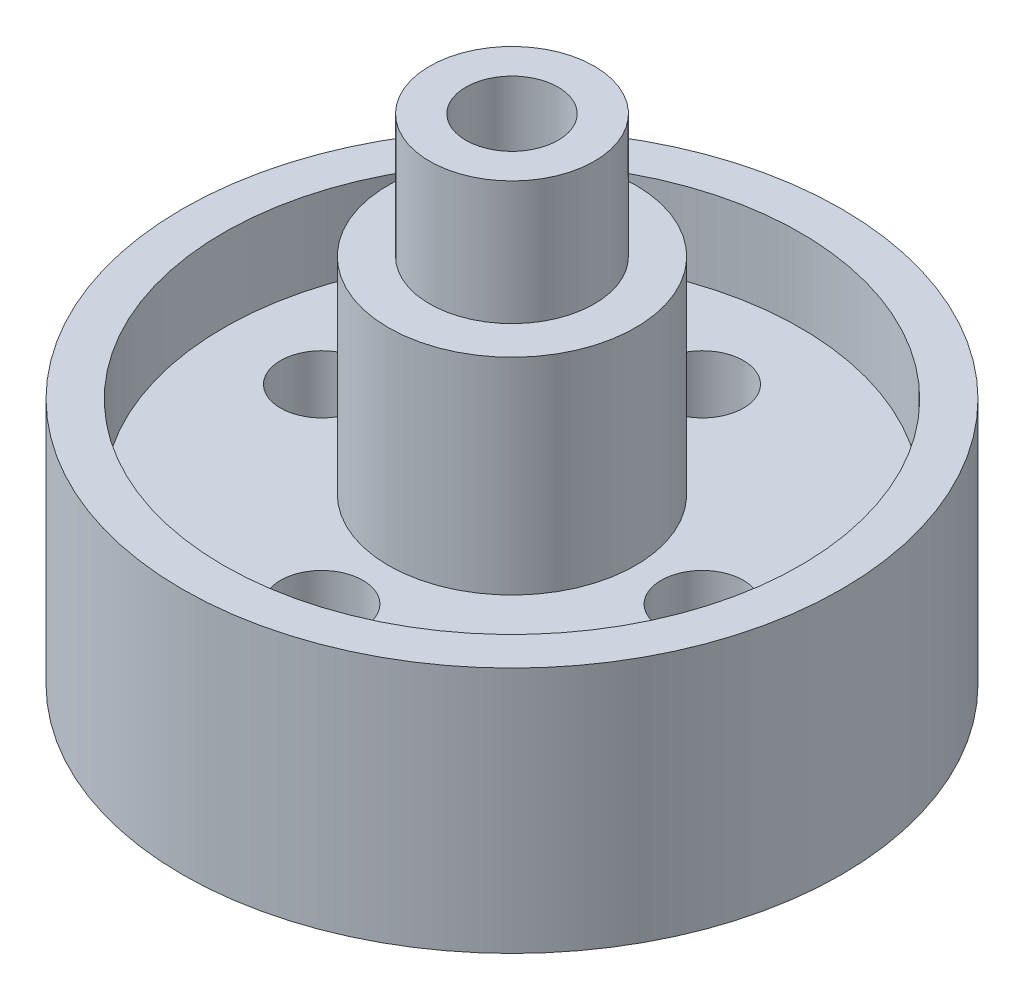
ISO-10303-21;
HEADER;
FILE_DESCRIPTION(('STEP AP214'),'2;1');
FILE_NAME('part.step','',(''),(''),'','','');
FILE_SCHEMA(('AUTOMOTIVE_DESIGN { 1 0 10303 214 1 1 1 1 }'));
ENDSEC;
DATA;
#1=APPLICATION_CONTEXT('core data for automotive mechanical design processes');
#2=APPLICATION_PROTOCOL_DEFINITION('international standard','automotive_design',2000,#1);
#3=PRODUCT_CONTEXT('',#1,'mechanical');
#4=PRODUCT('Part','Part','',(#3));
#5=PRODUCT_RELATED_PRODUCT_CATEGORY('part','',(#4));
#6=PRODUCT_DEFINITION_FORMATION('','',#4);
#7=PRODUCT_DEFINITION_CONTEXT('part definition',#1,'design');
#8=PRODUCT_DEFINITION('design','',#6,#7);
#9=PRODUCT_DEFINITION_SHAPE('','',#8);
#10=(LENGTH_UNIT() NAMED_UNIT(*) SI_UNIT(.MILLI.,.METRE.));
#11=(NAMED_UNIT(*) PLANE_ANGLE_UNIT() SI_UNIT($,.RADIAN.));
#12=(NAMED_UNIT(*) SI_UNIT($,.STERADIAN.) SOLID_ANGLE_UNIT());
#13=UNCERTAINTY_MEASURE_WITH_UNIT(LENGTH_MEASURE(1.E-05),#10,'distance_accuracy_value','');
#14=(GEOMETRIC_REPRESENTATION_CONTEXT(3) GLOBAL_UNCERTAINTY_ASSIGNED_CONTEXT((#13)) GLOBAL_UNIT_ASSIGNED_CONTEXT((#10,
#11,#12)) REPRESENTATION_CONTEXT('',''));
#15=CARTESIAN_POINT('',(0.,0.,0.));
#16=DIRECTION('',(0.,0.,1.));
#17=DIRECTION('',(1.,0.,0.));
#18=AXIS2_PLACEMENT_3D('',#15,#16,#17);
#19=CARTESIAN_POINT('',(0.,25.4,0.));
#20=DIRECTION('',(0.,-1.,0.));
#21=DIRECTION('',(0.,0.,-1.));
#22=AXIS2_PLACEMENT_3D('',#19,#20,#21);
#23=CYLINDRICAL_SURFACE('',#22,50.8);
#24=CARTESIAN_POINT('',(0.,0.,0.));
#25=DIRECTION('',(0.,1.,0.));
#26=DIRECTION('',(0.,0.,1.));
#27=AXIS2_PLACEMENT_3D('',#24,#25,#26);
#28=CIRCLE('',#27,50.8);
#29=CARTESIAN_POINT('',(0.,0.,50.8));
#30=VERTEX_POINT('',#29);
#31=EDGE_CURVE('E58',#30,#30,#28,.T.);
#32=ORIENTED_EDGE('',*,*,#31,.T.);
#33=EDGE_LOOP('',(#32));
#34=FACE_BOUND('',#33,.T.);
#35=CARTESIAN_POINT('',(0.,38.1,0.));
#36=DIRECTION('',(0.,1.,0.));
#37=DIRECTION('',(0.,0.,1.));
#38=AXIS2_PLACEMENT_3D('',#35,#36,#37);
#39=CIRCLE('',#38,50.8);
#40=CARTESIAN_POINT('',(0.,38.1,50.8));
#41=VERTEX_POINT('',#40);
#42=EDGE_CURVE('E75',#41,#41,#39,.T.);
#43=ORIENTED_EDGE('',*,*,#42,.F.);
#44=EDGE_LOOP('',(#43));
#45=FACE_BOUND('',#44,.T.);
#46=ADVANCED_FACE('F45',(#34,#45),#23,.T.);
#47=CARTESIAN_POINT('',(0.,25.4,0.));
#48=DIRECTION('',(0.,1.,0.));
#49=DIRECTION('',(0.,0.,1.));
#50=AXIS2_PLACEMENT_3D('',#47,#48,#49);
#51=PLANE('',#50);
#52=CARTESIAN_POINT('',(0.,25.4,0.));
#53=DIRECTION('',(0.,1.,0.));
#54=DIRECTION('',(0.,0.,1.));
#55=AXIS2_PLACEMENT_3D('',#52,#53,#54);
#56=CIRCLE('',#55,19.05);
#57=CARTESIAN_POINT('',(0.,25.4,19.05));
#58=VERTEX_POINT('',#57);
#59=EDGE_CURVE('E68',#58,#58,#56,.T.);
#60=ORIENTED_EDGE('',*,*,#59,.F.);
#61=EDGE_LOOP('',(#60));
#62=FACE_BOUND('',#61,.T.);
#63=CARTESIAN_POINT('',(0.,25.4,0.));
#64=DIRECTION('',(0.,1.,0.));
#65=DIRECTION('',(0.,0.,1.));
#66=AXIS2_PLACEMENT_3D('',#63,#64,#65);
#67=CIRCLE('',#66,44.45);
#68=CARTESIAN_POINT('',(0.,25.4,44.45));
#69=VERTEX_POINT('',#68);
#70=EDGE_CURVE('E48',#69,#69,#67,.F.);
#71=ORIENTED_EDGE('',*,*,#70,.F.);
#72=EDGE_LOOP('',(#71));
#73=FACE_BOUND('',#72,.T.);
#74=CARTESIAN_POINT('',(-29.337,25.4,0.));
#75=DIRECTION('',(0.,1.,0.));
#76=DIRECTION('',(0.,0.,1.));
#77=AXIS2_PLACEMENT_3D('',#74,#75,#76);
#78=CIRCLE('',#77,6.35);
#79=CARTESIAN_POINT('',(-29.337,25.4,6.35));
#80=VERTEX_POINT('',#79);
#81=EDGE_CURVE('E84',#80,#80,#78,.T.);
#82=ORIENTED_EDGE('',*,*,#81,.F.);
#83=EDGE_LOOP('',(#82));
#84=FACE_BOUND('',#83,.T.);
#85=CARTESIAN_POINT('',(1.02429588037641E-13,25.4,-29.337));
#86=DIRECTION('',(0.,1.,0.));
#87=DIRECTION('',(0.,0.,1.));
#88=AXIS2_PLACEMENT_3D('',#85,#86,#87);
#89=CIRCLE('',#88,6.35);
#90=CARTESIAN_POINT('',(1.02429588037641E-13,25.4,-22.987));
#91=VERTEX_POINT('',#90);
#92=EDGE_CURVE('E88',#91,#91,#89,.T.);
#93=ORIENTED_EDGE('',*,*,#92,.F.);
#94=EDGE_LOOP('',(#93));
#95=FACE_BOUND('',#94,.T.);
#96=CARTESIAN_POINT('',(29.337,25.4,2.04859176075282E-13));
#97=DIRECTION('',(0.,1.,0.));
#98=DIRECTION('',(0.,0.,1.));
#99=AXIS2_PLACEMENT_3D('',#96,#97,#98);
#100=CIRCLE('',#99,6.35);
#101=CARTESIAN_POINT('',(29.337,25.4,6.35000000000021));
#102=VERTEX_POINT('',#101);
#103=EDGE_CURVE('E96',#102,#102,#100,.T.);
#104=ORIENTED_EDGE('',*,*,#103,.F.);
#105=EDGE_LOOP('',(#104));
#106=FACE_BOUND('',#105,.T.);
#107=CARTESIAN_POINT('',(-3.07288764112923E-13,25.4,29.337));
#108=DIRECTION('',(0.,1.,0.));
#109=DIRECTION('',(0.,0.,1.));
#110=AXIS2_PLACEMENT_3D('',#107,#108,#109);
#111=CIRCLE('',#110,6.35);
#112=CARTESIAN_POINT('',(-3.07288764112923E-13,25.4,35.687));
#113=VERTEX_POINT('',#112);
#114=EDGE_CURVE('E104',#113,#113,#111,.T.);
#115=ORIENTED_EDGE('',*,*,#114,.F.);
#116=EDGE_LOOP('',(#115));
#117=FACE_BOUND('',#116,.T.);
#118=ADVANCED_FACE('F119',(#62,#73,#84,#95,#106,#117),#51,.T.);
#119=CARTESIAN_POINT('',(0.,0.,0.));
#120=DIRECTION('',(0.,1.,0.));
#121=DIRECTION('',(0.,0.,1.));
#122=AXIS2_PLACEMENT_3D('',#119,#120,#121);
#123=PLANE('',#122);
#124=CARTESIAN_POINT('',(0.,0.,0.));
#125=DIRECTION('',(0.,1.,0.));
#126=DIRECTION('',(0.,0.,1.));
#127=AXIS2_PLACEMENT_3D('',#124,#125,#126);
#128=CIRCLE('',#127,7.112);
#129=CARTESIAN_POINT('',(0.,0.,7.112));
#130=VERTEX_POINT('',#129);
#131=EDGE_CURVE('E281',#130,#130,#128,.T.);
#132=ORIENTED_EDGE('',*,*,#131,.T.);
#133=EDGE_LOOP('',(#132));
#134=FACE_BOUND('',#133,.T.);
#135=CARTESIAN_POINT('',(-29.337,0.,0.));
#136=DIRECTION('',(0.,1.,0.));
#137=DIRECTION('',(0.,0.,1.));
#138=AXIS2_PLACEMENT_3D('',#135,#136,#137);
#139=CIRCLE('',#138,6.35);
#140=CARTESIAN_POINT('',(-29.337,0.,6.35));
#141=VERTEX_POINT('',#140);
#142=EDGE_CURVE('E80',#141,#141,#139,.T.);
#143=ORIENTED_EDGE('',*,*,#142,.T.);
#144=EDGE_LOOP('',(#143));
#145=FACE_BOUND('',#144,.T.);
#146=CARTESIAN_POINT('',(1.02429588037641E-13,0.,-29.337));
#147=DIRECTION('',(0.,1.,0.));
#148=DIRECTION('',(0.,0.,1.));
#149=AXIS2_PLACEMENT_3D('',#146,#147,#148);
#150=CIRCLE('',#149,6.35);
#151=CARTESIAN_POINT('',(1.02429588037641E-13,0.,-22.987));
#152=VERTEX_POINT('',#151);
#153=EDGE_CURVE('E92',#152,#152,#150,.T.);
#154=ORIENTED_EDGE('',*,*,#153,.T.);
#155=EDGE_LOOP('',(#154));
#156=FACE_BOUND('',#155,.T.);
#157=CARTESIAN_POINT('',(29.337,0.,2.04859176075282E-13));
#158=DIRECTION('',(0.,1.,0.));
#159=DIRECTION('',(0.,0.,1.));
#160=AXIS2_PLACEMENT_3D('',#157,#158,#159);
#161=CIRCLE('',#160,6.35);
#162=CARTESIAN_POINT('',(29.337,0.,6.35000000000021));
#163=VERTEX_POINT('',#162);
#164=EDGE_CURVE('E100',#163,#163,#161,.T.);
#165=ORIENTED_EDGE('',*,*,#164,.T.);
#166=EDGE_LOOP('',(#165));
#167=FACE_BOUND('',#166,.T.);
#168=CARTESIAN_POINT('',(-3.07288764112923E-13,0.,29.337));
#169=DIRECTION('',(0.,1.,0.));
#170=DIRECTION('',(0.,0.,1.));
#171=AXIS2_PLACEMENT_3D('',#168,#169,#170);
#172=CIRCLE('',#171,6.35);
#173=CARTESIAN_POINT('',(-3.07288764112923E-13,0.,35.687));
#174=VERTEX_POINT('',#173);
#175=EDGE_CURVE('E79',#174,#174,#172,.T.);
#176=ORIENTED_EDGE('',*,*,#175,.T.);
#177=EDGE_LOOP('',(#176));
#178=FACE_BOUND('',#177,.T.);
#179=ORIENTED_EDGE('',*,*,#31,.F.);
#180=EDGE_LOOP('',(#179));
#181=FACE_BOUND('',#180,.T.);
#182=ADVANCED_FACE('F116',(#134,#145,#156,#167,#178,#181),#123,.F.);
#183=CARTESIAN_POINT('',(-3.07288764112923E-13,0.,29.337));
#184=DIRECTION('',(0.,1.,0.));
#185=DIRECTION('',(0.,0.,1.));
#186=AXIS2_PLACEMENT_3D('',#183,#184,#185);
#187=CYLINDRICAL_SURFACE('',#186,6.35);
#188=ORIENTED_EDGE('',*,*,#175,.F.);
#189=EDGE_LOOP('',(#188));
#190=FACE_BOUND('',#189,.T.);
#191=ORIENTED_EDGE('',*,*,#114,.T.);
#192=EDGE_LOOP('',(#191));
#193=FACE_BOUND('',#192,.T.);
#194=ADVANCED_FACE('F118',(#190,#193),#187,.F.);
#195=CARTESIAN_POINT('',(29.337,0.,2.04859176075282E-13));
#196=DIRECTION('',(0.,1.,0.));
#197=DIRECTION('',(0.,0.,1.));
#198=AXIS2_PLACEMENT_3D('',#195,#196,#197);
#199=CYLINDRICAL_SURFACE('',#198,6.35);
#200=ORIENTED_EDGE('',*,*,#164,.F.);
#201=EDGE_LOOP('',(#200));
#202=FACE_BOUND('',#201,.T.);
#203=ORIENTED_EDGE('',*,*,#103,.T.);
#204=EDGE_LOOP('',(#203));
#205=FACE_BOUND('',#204,.T.);
#206=ADVANCED_FACE('F126',(#202,#205),#199,.F.);
#207=CARTESIAN_POINT('',(1.02429588037641E-13,0.,-29.337));
#208=DIRECTION('',(0.,1.,0.));
#209=DIRECTION('',(0.,0.,1.));
#210=AXIS2_PLACEMENT_3D('',#207,#208,#209);
#211=CYLINDRICAL_SURFACE('',#210,6.35);
#212=ORIENTED_EDGE('',*,*,#153,.F.);
#213=EDGE_LOOP('',(#212));
#214=FACE_BOUND('',#213,.T.);
#215=ORIENTED_EDGE('',*,*,#92,.T.);
#216=EDGE_LOOP('',(#215));
#217=FACE_BOUND('',#216,.T.);
#218=ADVANCED_FACE('F219',(#214,#217),#211,.F.);
#219=CARTESIAN_POINT('',(-29.337,0.,0.));
#220=DIRECTION('',(0.,1.,0.));
#221=DIRECTION('',(0.,0.,1.));
#222=AXIS2_PLACEMENT_3D('',#219,#220,#221);
#223=CYLINDRICAL_SURFACE('',#222,6.35);
#224=ORIENTED_EDGE('',*,*,#142,.F.);
#225=EDGE_LOOP('',(#224));
#226=FACE_BOUND('',#225,.T.);
#227=ORIENTED_EDGE('',*,*,#81,.T.);
#228=EDGE_LOOP('',(#227));
#229=FACE_BOUND('',#228,.T.);
#230=ADVANCED_FACE('F143',(#226,#229),#223,.F.);
#231=CARTESIAN_POINT('',(0.,38.1,0.));
#232=DIRECTION('',(0.,-1.,0.));
#233=DIRECTION('',(0.,0.,-1.));
#234=AXIS2_PLACEMENT_3D('',#231,#232,#233);
#235=CYLINDRICAL_SURFACE('',#234,44.45);
#236=CARTESIAN_POINT('',(0.,38.1,0.));
#237=DIRECTION('',(0.,1.,0.));
#238=DIRECTION('',(0.,0.,1.));
#239=AXIS2_PLACEMENT_3D('',#236,#237,#238);
#240=CIRCLE('',#239,44.45);
#241=CARTESIAN_POINT('',(0.,38.1,44.45));
#242=VERTEX_POINT('',#241);
#243=EDGE_CURVE('E67',#242,#242,#240,.T.);
#244=ORIENTED_EDGE('',*,*,#243,.T.);
#245=EDGE_LOOP('',(#244));
#246=FACE_BOUND('',#245,.T.);
#247=ORIENTED_EDGE('',*,*,#70,.T.);
#248=EDGE_LOOP('',(#247));
#249=FACE_BOUND('',#248,.T.);
#250=ADVANCED_FACE('F147',(#246,#249),#235,.F.);
#251=CARTESIAN_POINT('',(0.,38.1,0.));
#252=DIRECTION('',(0.,1.,0.));
#253=DIRECTION('',(0.,0.,1.));
#254=AXIS2_PLACEMENT_3D('',#251,#252,#253);
#255=PLANE('',#254);
#256=ORIENTED_EDGE('',*,*,#243,.F.);
#257=EDGE_LOOP('',(#256));
#258=FACE_BOUND('',#257,.T.);
#259=ORIENTED_EDGE('',*,*,#42,.T.);
#260=EDGE_LOOP('',(#259));
#261=FACE_BOUND('',#260,.T.);
#262=ADVANCED_FACE('F150',(#258,#261),#255,.T.);
#263=CARTESIAN_POINT('',(0.,57.15,0.));
#264=DIRECTION('',(0.,-1.,0.));
#265=DIRECTION('',(0.,0.,-1.));
#266=AXIS2_PLACEMENT_3D('',#263,#264,#265);
#267=CYLINDRICAL_SURFACE('',#266,19.05);
#268=CARTESIAN_POINT('',(0.,57.15,0.));
#269=DIRECTION('',(0.,1.,0.));
#270=DIRECTION('',(0.,0.,1.));
#271=AXIS2_PLACEMENT_3D('',#268,#269,#270);
#272=CIRCLE('',#271,19.05);
#273=CARTESIAN_POINT('',(0.,57.15,19.05));
#274=VERTEX_POINT('',#273);
#275=EDGE_CURVE('E63',#274,#274,#272,.T.);
#276=ORIENTED_EDGE('',*,*,#275,.F.);
#277=EDGE_LOOP('',(#276));
#278=FACE_BOUND('',#277,.T.);
#279=ORIENTED_EDGE('',*,*,#59,.T.);
#280=EDGE_LOOP('',(#279));
#281=FACE_BOUND('',#280,.T.);
#282=ADVANCED_FACE('F158',(#278,#281),#267,.T.);
#283=CARTESIAN_POINT('',(0.,57.15,0.));
#284=DIRECTION('',(0.,1.,0.));
#285=DIRECTION('',(0.,0.,1.));
#286=AXIS2_PLACEMENT_3D('',#283,#284,#285);
#287=PLANE('',#286);
#288=CARTESIAN_POINT('',(0.,57.15,0.));
#289=DIRECTION('',(0.,1.,0.));
#290=DIRECTION('',(0.,0.,1.));
#291=AXIS2_PLACEMENT_3D('',#288,#289,#290);
#292=CIRCLE('',#291,12.7);
#293=CARTESIAN_POINT('',(0.,57.15,-12.7));
#294=VERTEX_POINT('',#293);
#295=EDGE_CURVE('E10',#294,#294,#292,.T.);
#296=ORIENTED_EDGE('',*,*,#295,.F.);
#297=EDGE_LOOP('',(#296));
#298=FACE_BOUND('',#297,.T.);
#299=ORIENTED_EDGE('',*,*,#275,.T.);
#300=EDGE_LOOP('',(#299));
#301=FACE_BOUND('',#300,.T.);
#302=ADVANCED_FACE('F174',(#298,#301),#287,.T.);
#303=CARTESIAN_POINT('',(0.,76.2,0.));
#304=DIRECTION('',(0.,-1.,0.));
#305=DIRECTION('',(0.,0.,-1.));
#306=AXIS2_PLACEMENT_3D('',#303,#304,#305);
#307=CYLINDRICAL_SURFACE('',#306,12.7);
#308=CARTESIAN_POINT('',(0.,76.2,0.));
#309=DIRECTION('',(0.,1.,0.));
#310=DIRECTION('',(0.,0.,1.));
#311=AXIS2_PLACEMENT_3D('',#308,#309,#310);
#312=CIRCLE('',#311,12.7);
#313=CARTESIAN_POINT('',(0.,76.2,-12.7));
#314=VERTEX_POINT('',#313);
#315=EDGE_CURVE('E61',#314,#314,#312,.T.);
#316=CARTESIAN_POINT('',(0.,76.2,-12.7));
#317=CARTESIAN_POINT('',(0.,76.0015625,-12.7));
#318=CARTESIAN_POINT('',(0.,75.803125,-12.7));
#319=CARTESIAN_POINT('',(0.,75.40625,-12.7));
#320=CARTESIAN_POINT('',(0.,75.2078125,-12.7));
#321=CARTESIAN_POINT('',(0.,74.8109375,-12.7));
#322=CARTESIAN_POINT('',(0.,74.6125,-12.7));
#323=CARTESIAN_POINT('',(0.,74.215625,-12.7));
#324=CARTESIAN_POINT('',(0.,74.0171875,-12.7));
#325=CARTESIAN_POINT('',(0.,73.6203125,-12.7));
#326=CARTESIAN_POINT('',(0.,73.421875,-12.7));
#327=CARTESIAN_POINT('',(0.,73.025,-12.7));
#328=CARTESIAN_POINT('',(0.,72.8265625,-12.7));
#329=CARTESIAN_POINT('',(0.,72.4296875,-12.7));
#330=CARTESIAN_POINT('',(0.,72.23125,-12.7));
#331=CARTESIAN_POINT('',(0.,71.834375,-12.7));
#332=CARTESIAN_POINT('',(0.,71.6359375,-12.7));
#333=CARTESIAN_POINT('',(0.,71.2390625,-12.7));
#334=CARTESIAN_POINT('',(0.,71.040625,-12.7));
#335=CARTESIAN_POINT('',(0.,70.64375,-12.7));
#336=CARTESIAN_POINT('',(0.,70.4453125,-12.7));
#337=CARTESIAN_POINT('',(0.,70.0484375,-12.7));
#338=CARTESIAN_POINT('',(0.,69.85,-12.7));
#339=CARTESIAN_POINT('',(0.,69.453125,-12.7));
#340=CARTESIAN_POINT('',(0.,69.2546875,-12.7));
#341=CARTESIAN_POINT('',(0.,68.8578125,-12.7));
#342=CARTESIAN_POINT('',(0.,68.659375,-12.7));
#343=CARTESIAN_POINT('',(0.,68.2625,-12.7));
#344=CARTESIAN_POINT('',(0.,68.0640625,-12.7));
#345=CARTESIAN_POINT('',(0.,67.6671875,-12.7));
#346=CARTESIAN_POINT('',(0.,67.46875,-12.7));
#347=CARTESIAN_POINT('',(0.,67.071875,-12.7));
#348=CARTESIAN_POINT('',(0.,66.8734375,-12.7));
#349=CARTESIAN_POINT('',(0.,66.4765625,-12.7));
#350=CARTESIAN_POINT('',(0.,66.278125,-12.7));
#351=CARTESIAN_POINT('',(0.,65.88125,-12.7));
#352=CARTESIAN_POINT('',(0.,65.6828125,-12.7));
#353=CARTESIAN_POINT('',(0.,65.2859375,-12.7));
#354=CARTESIAN_POINT('',(0.,65.0875,-12.7));
#355=CARTESIAN_POINT('',(0.,64.690625,-12.7));
#356=CARTESIAN_POINT('',(0.,64.4921875,-12.7));
#357=CARTESIAN_POINT('',(0.,64.0953125,-12.7));
#358=CARTESIAN_POINT('',(0.,63.896875,-12.7));
#359=CARTESIAN_POINT('',(0.,63.5,-12.7));
#360=CARTESIAN_POINT('',(0.,63.3015625,-12.7));
#361=CARTESIAN_POINT('',(0.,62.9046875,-12.7));
#362=CARTESIAN_POINT('',(0.,62.70625,-12.7));
#363=CARTESIAN_POINT('',(0.,62.309375,-12.7));
#364=CARTESIAN_POINT('',(0.,62.1109375,-12.7));
#365=CARTESIAN_POINT('',(0.,61.7140625,-12.7));
#366=CARTESIAN_POINT('',(0.,61.515625,-12.7));
#367=CARTESIAN_POINT('',(0.,61.11875,-12.7));
#368=CARTESIAN_POINT('',(0.,60.9203125,-12.7));
#369=CARTESIAN_POINT('',(0.,60.5234375,-12.7));
#370=CARTESIAN_POINT('',(0.,60.325,-12.7));
#371=CARTESIAN_POINT('',(0.,59.928125,-12.7));
#372=CARTESIAN_POINT('',(0.,59.7296875,-12.7));
#373=CARTESIAN_POINT('',(0.,59.3328125,-12.7));
#374=CARTESIAN_POINT('',(0.,59.134375,-12.7));
#375=CARTESIAN_POINT('',(0.,58.7375,-12.7));
#376=CARTESIAN_POINT('',(0.,58.5390625,-12.7));
#377=CARTESIAN_POINT('',(0.,58.1421875,-12.7));
#378=CARTESIAN_POINT('',(0.,57.94375,-12.7));
#379=CARTESIAN_POINT('',(0.,57.546875,-12.7));
#380=CARTESIAN_POINT('',(0.,57.3484375,-12.7));
#381=CARTESIAN_POINT('',(0.,57.15,-12.7));
#382=B_SPLINE_CURVE_WITH_KNOTS('',3,(#316,#317,#318,#319,#320,#321,#322,#323,#324,#325,#326,
#327,#328,#329,#330,#331,#332,#333,#334,#335,#336,#337,#338,#339,#340,#341,#342,#343,#344,#345,
#346,#347,#348,#349,#350,#351,#352,#353,#354,#355,#356,#357,#358,#359,#360,#361,#362,#363,#364,
#365,#366,#367,#368,#369,#370,#371,#372,#373,#374,#375,#376,#377,#378,#379,#380,#381),
.UNSPECIFIED.,.F.,.F.,(4,2,2,2,2,2,2,2,2,2,2,2,2,2,2,2,2,2,2,2,2,2,2,2,2,2,2,2,2,2,2,2,4),(0.,
0.5953125,1.190625,1.7859375,2.38125,2.9765625,3.571875,4.1671875,4.7625,5.3578125,5.953125,
6.5484375,7.14375,7.7390625,8.334375,8.92968750000001,9.52500000000001,10.1203125,10.715625,
11.3109375,11.90625,12.5015625,13.096875,13.6921875,14.2875,14.8828125,15.478125,16.0734375,
16.66875,17.2640625,17.859375,18.4546875,19.05),.UNSPECIFIED.);
#383=EDGE_CURVE('BSEAM182',#314,#294,#382,.T.);
#384=ORIENTED_EDGE('',*,*,#315,.F.);
#385=ORIENTED_EDGE('',*,*,#295,.T.);
#386=ORIENTED_EDGE('',*,*,#383,.T.);
#387=ORIENTED_EDGE('',*,*,#383,.F.);
#388=EDGE_LOOP('',(#384,#386,#385,#387));
#389=FACE_BOUND('',#388,.T.);
#390=ADVANCED_FACE('F182',(#389),#307,.T.);
#391=CARTESIAN_POINT('',(0.,76.2,0.));
#392=DIRECTION('',(0.,1.,0.));
#393=DIRECTION('',(0.,0.,1.));
#394=AXIS2_PLACEMENT_3D('',#391,#392,#393);
#395=PLANE('',#394);
#396=CARTESIAN_POINT('',(0.,76.2,0.));
#397=DIRECTION('',(0.,1.,0.));
#398=DIRECTION('',(0.,0.,1.));
#399=AXIS2_PLACEMENT_3D('',#396,#397,#398);
#400=CIRCLE('',#399,7.112);
#401=CARTESIAN_POINT('',(0.,76.2,7.112));
#402=VERTEX_POINT('',#401);
#403=EDGE_CURVE('E284',#402,#402,#400,.T.);
#404=ORIENTED_EDGE('',*,*,#403,.F.);
#405=EDGE_LOOP('',(#404));
#406=FACE_BOUND('',#405,.T.);
#407=ORIENTED_EDGE('',*,*,#315,.T.);
#408=EDGE_LOOP('',(#407));
#409=FACE_BOUND('',#408,.T.);
#410=ADVANCED_FACE('F190',(#406,#409),#395,.T.);
#411=CARTESIAN_POINT('',(0.,0.,0.));
#412=DIRECTION('',(0.,1.,0.));
#413=DIRECTION('',(0.,0.,1.));
#414=AXIS2_PLACEMENT_3D('',#411,#412,#413);
#415=CYLINDRICAL_SURFACE('',#414,7.112);
#416=CARTESIAN_POINT('',(0.,0.,7.112));
#417=CARTESIAN_POINT('',(0.,0.79375,7.112));
#418=CARTESIAN_POINT('',(0.,1.5875,7.112));
#419=CARTESIAN_POINT('',(0.,3.175,7.112));
#420=CARTESIAN_POINT('',(0.,3.96875,7.112));
#421=CARTESIAN_POINT('',(0.,5.55625,7.112));
#422=CARTESIAN_POINT('',(0.,6.35,7.112));
#423=CARTESIAN_POINT('',(0.,7.9375,7.112));
#424=CARTESIAN_POINT('',(0.,8.73125,7.112));
#425=CARTESIAN_POINT('',(0.,10.31875,7.112));
#426=CARTESIAN_POINT('',(0.,11.1125,7.112));
#427=CARTESIAN_POINT('',(0.,12.7,7.112));
#428=CARTESIAN_POINT('',(0.,13.49375,7.112));
#429=CARTESIAN_POINT('',(0.,15.08125,7.112));
#430=CARTESIAN_POINT('',(0.,15.875,7.112));
#431=CARTESIAN_POINT('',(0.,17.4625,7.112));
#432=CARTESIAN_POINT('',(0.,18.25625,7.112));
#433=CARTESIAN_POINT('',(0.,19.84375,7.112));
#434=CARTESIAN_POINT('',(0.,20.6375,7.112));
#435=CARTESIAN_POINT('',(0.,22.225,7.112));
#436=CARTESIAN_POINT('',(0.,23.01875,7.112));
#437=CARTESIAN_POINT('',(0.,24.60625,7.112));
#438=CARTESIAN_POINT('',(0.,25.4,7.112));
#439=CARTESIAN_POINT('',(0.,26.9875,7.112));
#440=CARTESIAN_POINT('',(0.,27.78125,7.112));
#441=CARTESIAN_POINT('',(0.,29.36875,7.112));
#442=CARTESIAN_POINT('',(0.,30.1625,7.112));
#443=CARTESIAN_POINT('',(0.,31.75,7.112));
#444=CARTESIAN_POINT('',(0.,32.54375,7.112));
#445=CARTESIAN_POINT('',(0.,34.13125,7.112));
#446=CARTESIAN_POINT('',(0.,34.925,7.112));
#447=CARTESIAN_POINT('',(0.,36.5125,7.112));
#448=CARTESIAN_POINT('',(0.,37.30625,7.112));
#449=CARTESIAN_POINT('',(0.,38.89375,7.112));
#450=CARTESIAN_POINT('',(0.,39.6875,7.112));
#451=CARTESIAN_POINT('',(0.,41.275,7.112));
#452=CARTESIAN_POINT('',(0.,42.06875,7.112));
#453=CARTESIAN_POINT('',(0.,43.65625,7.112));
#454=CARTESIAN_POINT('',(0.,44.45,7.112));
#455=CARTESIAN_POINT('',(0.,46.0375,7.112));
#456=CARTESIAN_POINT('',(0.,46.83125,7.112));
#457=CARTESIAN_POINT('',(0.,48.41875,7.112));
#458=CARTESIAN_POINT('',(0.,49.2125,7.112));
#459=CARTESIAN_POINT('',(0.,50.8,7.112));
#460=CARTESIAN_POINT('',(0.,51.59375,7.112));
#461=CARTESIAN_POINT('',(0.,53.18125,7.112));
#462=CARTESIAN_POINT('',(0.,53.975,7.112));
#463=CARTESIAN_POINT('',(0.,55.5625,7.112));
#464=CARTESIAN_POINT('',(0.,56.35625,7.112));
#465=CARTESIAN_POINT('',(0.,57.94375,7.112));
#466=CARTESIAN_POINT('',(0.,58.7375,7.112));
#467=CARTESIAN_POINT('',(0.,60.325,7.112));
#468=CARTESIAN_POINT('',(0.,61.11875,7.112));
#469=CARTESIAN_POINT('',(0.,62.70625,7.112));
#470=CARTESIAN_POINT('',(0.,63.5,7.112));
#471=CARTESIAN_POINT('',(0.,65.0875,7.112));
#472=CARTESIAN_POINT('',(0.,65.88125,7.112));
#473=CARTESIAN_POINT('',(0.,67.46875,7.112));
#474=CARTESIAN_POINT('',(0.,68.2625,7.112));
#475=CARTESIAN_POINT('',(0.,69.85,7.112));
#476=CARTESIAN_POINT('',(0.,70.64375,7.112));
#477=CARTESIAN_POINT('',(0.,72.23125,7.112));
#478=CARTESIAN_POINT('',(0.,73.025,7.112));
#479=CARTESIAN_POINT('',(0.,74.6125,7.112));
#480=CARTESIAN_POINT('',(0.,75.40625,7.112));
#481=CARTESIAN_POINT('',(0.,76.2,7.112));
#482=B_SPLINE_CURVE_WITH_KNOTS('',3,(#416,#417,#418,#419,#420,#421,#422,#423,#424,#425,#426,
#427,#428,#429,#430,#431,#432,#433,#434,#435,#436,#437,#438,#439,#440,#441,#442,#443,#444,#445,
#446,#447,#448,#449,#450,#451,#452,#453,#454,#455,#456,#457,#458,#459,#460,#461,#462,#463,#464,
#465,#466,#467,#468,#469,#470,#471,#472,#473,#474,#475,#476,#477,#478,#479,#480,#481),
.UNSPECIFIED.,.F.,.F.,(4,2,2,2,2,2,2,2,2,2,2,2,2,2,2,2,2,2,2,2,2,2,2,2,2,2,2,2,2,2,2,2,4),(0.,
2.38125,4.7625,7.14375,9.525,11.90625,14.2875,16.66875,19.05,21.43125,23.8125,26.19375,28.575,
30.95625,33.3375,35.71875,38.1,40.48125,42.8625,45.24375,47.625,50.00625,52.3875,54.76875,57.15,
59.53125,61.9125,64.29375,66.675,69.05625,71.4375,73.81875,76.2),.UNSPECIFIED.);
#483=EDGE_CURVE('BSEAM202',#130,#402,#482,.T.);
#484=ORIENTED_EDGE('',*,*,#131,.F.);
#485=ORIENTED_EDGE('',*,*,#403,.T.);
#486=ORIENTED_EDGE('',*,*,#483,.T.);
#487=ORIENTED_EDGE('',*,*,#483,.F.);
#488=EDGE_LOOP('',(#484,#486,#485,#487));
#489=FACE_BOUND('',#488,.T.);
#490=ADVANCED_FACE('F202',(#489),#415,.F.);
#491=CLOSED_SHELL('',(#46,#118,#182,#194,#206,#218,#230,#250,#262,#282,#302,#390,#410,#490));
#492=MANIFOLD_SOLID_BREP('B2',#491);
#493=ADVANCED_BREP_SHAPE_REPRESENTATION('',(#18,#492),#14);
#494=SHAPE_DEFINITION_REPRESENTATION(#9,#493);
ENDSEC;
END-ISO-10303-21;
